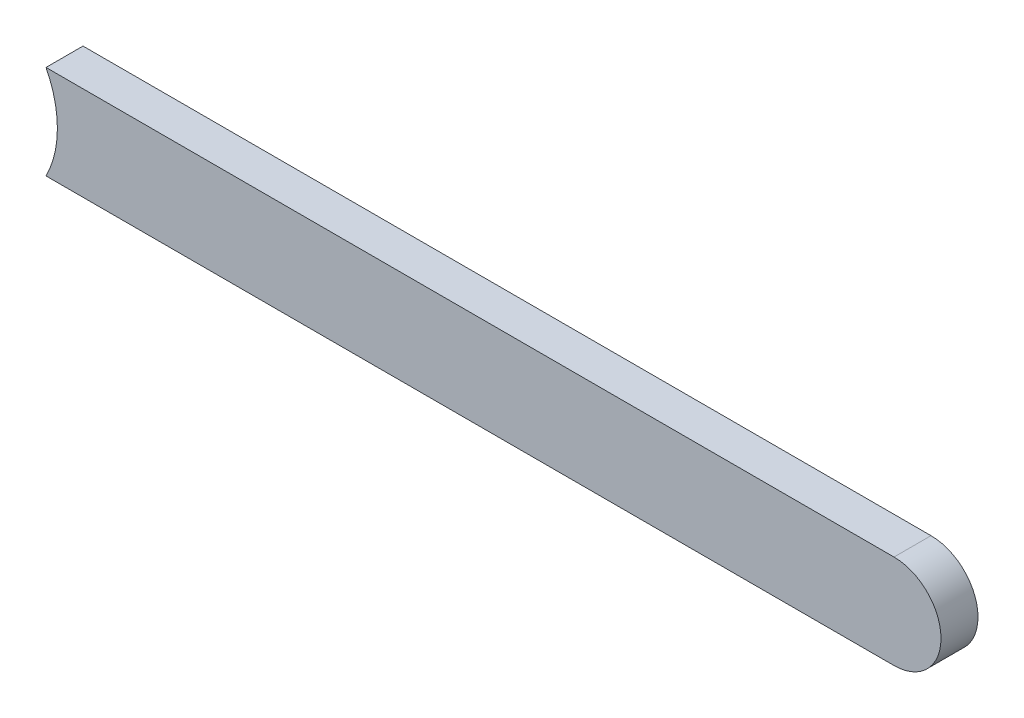
ISO-10303-21;
HEADER;
FILE_DESCRIPTION(('STEP AP214'),'2;1');
FILE_NAME('part.step','',(''),(''),'','','');
FILE_SCHEMA(('AUTOMOTIVE_DESIGN { 1 0 10303 214 1 1 1 1 }'));
ENDSEC;
DATA;
#1=APPLICATION_CONTEXT('core data for automotive mechanical design processes');
#2=APPLICATION_PROTOCOL_DEFINITION('international standard','automotive_design',2000,#1);
#3=PRODUCT_CONTEXT('',#1,'mechanical');
#4=PRODUCT('Part','Part','',(#3));
#5=PRODUCT_RELATED_PRODUCT_CATEGORY('part','',(#4));
#6=PRODUCT_DEFINITION_FORMATION('','',#4);
#7=PRODUCT_DEFINITION_CONTEXT('part definition',#1,'design');
#8=PRODUCT_DEFINITION('design','',#6,#7);
#9=PRODUCT_DEFINITION_SHAPE('','',#8);
#10=(LENGTH_UNIT() NAMED_UNIT(*) SI_UNIT(.MILLI.,.METRE.));
#11=(NAMED_UNIT(*) PLANE_ANGLE_UNIT() SI_UNIT($,.RADIAN.));
#12=(NAMED_UNIT(*) SI_UNIT($,.STERADIAN.) SOLID_ANGLE_UNIT());
#13=UNCERTAINTY_MEASURE_WITH_UNIT(LENGTH_MEASURE(1.E-05),#10,'distance_accuracy_value','');
#14=(GEOMETRIC_REPRESENTATION_CONTEXT(3) GLOBAL_UNCERTAINTY_ASSIGNED_CONTEXT((#13)) GLOBAL_UNIT_ASSIGNED_CONTEXT((#10,
#11,#12)) REPRESENTATION_CONTEXT('',''));
#15=CARTESIAN_POINT('',(0.,0.,0.));
#16=DIRECTION('',(0.,0.,1.));
#17=DIRECTION('',(1.,0.,0.));
#18=AXIS2_PLACEMENT_3D('',#15,#16,#17);
#19=CARTESIAN_POINT('',(134.224466490858,88.1350028,0.));
#20=DIRECTION('',(0.,1.,0.));
#21=DIRECTION('',(1.,0.,0.));
#22=AXIS2_PLACEMENT_3D('',#19,#20,#21);
#23=PLANE('',#22);
#24=DIRECTION('',(1.,0.,0.));
#25=VECTOR('',#24,1.);
#26=CARTESIAN_POINT('',(133.731,88.1350028,0.1999996));
#27=LINE('',#26,#25);
#28=CARTESIAN_POINT('',(134.224466490858,88.1350028,0.1999996));
#29=VERTEX_POINT('',#28);
#30=CARTESIAN_POINT('',(138.8080028,88.1350028,0.1999996));
#31=VERTEX_POINT('',#30);
#32=EDGE_CURVE('E11',#29,#31,#27,.T.);
#33=ORIENTED_EDGE('',*,*,#32,.F.);
#34=DIRECTION('',(0.,0.,1.));
#35=VECTOR('',#34,1.);
#36=CARTESIAN_POINT('',(134.224466490858,88.1350028,0.));
#37=LINE('',#36,#35);
#38=CARTESIAN_POINT('',(134.224466490858,88.1350028,0.));
#39=VERTEX_POINT('',#38);
#40=EDGE_CURVE('E24',#39,#29,#37,.T.);
#41=ORIENTED_EDGE('',*,*,#40,.F.);
#42=DIRECTION('',(1.,0.,0.));
#43=VECTOR('',#42,1.);
#44=CARTESIAN_POINT('',(133.731,88.1350028,0.));
#45=LINE('',#44,#43);
#46=CARTESIAN_POINT('',(138.8080028,88.1350028,0.));
#47=VERTEX_POINT('',#46);
#48=EDGE_CURVE('E82',#39,#47,#45,.T.);
#49=ORIENTED_EDGE('',*,*,#48,.T.);
#50=DIRECTION('',(0.,0.,1.));
#51=VECTOR('',#50,1.);
#52=CARTESIAN_POINT('',(138.8080028,88.1350028,0.));
#53=LINE('',#52,#51);
#54=EDGE_CURVE('E37',#47,#31,#53,.T.);
#55=ORIENTED_EDGE('',*,*,#54,.T.);
#56=EDGE_LOOP('',(#33,#41,#49,#55));
#57=FACE_BOUND('',#56,.T.);
#58=ADVANCED_FACE('F17',(#57),#23,.F.);
#59=CARTESIAN_POINT('',(138.8080028,88.3890028,0.));
#60=DIRECTION('',(0.,0.,-1.));
#61=DIRECTION('',(0.,-1.,0.));
#62=AXIS2_PLACEMENT_3D('',#59,#60,#61);
#63=CYLINDRICAL_SURFACE('',#62,0.253999999999995);
#64=CARTESIAN_POINT('',(138.8080028,88.3890028,0.1999996));
#65=DIRECTION('',(0.,0.,1.));
#66=DIRECTION('',(0.,-1.,0.));
#67=AXIS2_PLACEMENT_3D('',#64,#65,#66);
#68=CIRCLE('',#67,0.253999999999995);
#69=CARTESIAN_POINT('',(138.8080028,88.6430028,0.1999996));
#70=VERTEX_POINT('',#69);
#71=EDGE_CURVE('E97',#31,#70,#68,.T.);
#72=ORIENTED_EDGE('',*,*,#71,.F.);
#73=ORIENTED_EDGE('',*,*,#54,.F.);
#74=CARTESIAN_POINT('',(138.8080028,88.3890028,0.));
#75=DIRECTION('',(0.,0.,1.));
#76=DIRECTION('',(0.,-1.,0.));
#77=AXIS2_PLACEMENT_3D('',#74,#75,#76);
#78=CIRCLE('',#77,0.253999999999995);
#79=CARTESIAN_POINT('',(138.8080028,88.6430028,0.));
#80=VERTEX_POINT('',#79);
#81=EDGE_CURVE('E94',#47,#80,#78,.T.);
#82=ORIENTED_EDGE('',*,*,#81,.T.);
#83=DIRECTION('',(0.,0.,1.));
#84=VECTOR('',#83,1.);
#85=CARTESIAN_POINT('',(138.8080028,88.6430028,0.));
#86=LINE('',#85,#84);
#87=EDGE_CURVE('E92',#80,#70,#86,.T.);
#88=ORIENTED_EDGE('',*,*,#87,.T.);
#89=EDGE_LOOP('',(#72,#73,#82,#88));
#90=FACE_BOUND('',#89,.T.);
#91=ADVANCED_FACE('F103',(#90),#63,.T.);
#92=CARTESIAN_POINT('',(138.8080028,88.6430028,0.));
#93=DIRECTION('',(0.,-1.,0.));
#94=DIRECTION('',(-1.,0.,0.));
#95=AXIS2_PLACEMENT_3D('',#92,#93,#94);
#96=PLANE('',#95);
#97=DIRECTION('',(-1.,0.,0.));
#98=VECTOR('',#97,1.);
#99=CARTESIAN_POINT('',(138.8080028,88.6430028,0.1999996));
#100=LINE('',#99,#98);
#101=CARTESIAN_POINT('',(134.224466490858,88.6430028,0.1999996));
#102=VERTEX_POINT('',#101);
#103=EDGE_CURVE('E89',#70,#102,#100,.T.);
#104=ORIENTED_EDGE('',*,*,#103,.F.);
#105=ORIENTED_EDGE('',*,*,#87,.F.);
#106=DIRECTION('',(-1.,0.,0.));
#107=VECTOR('',#106,1.);
#108=CARTESIAN_POINT('',(138.8080028,88.6430028,0.));
#109=LINE('',#108,#107);
#110=CARTESIAN_POINT('',(134.224466490858,88.6430028,0.));
#111=VERTEX_POINT('',#110);
#112=EDGE_CURVE('E87',#80,#111,#109,.T.);
#113=ORIENTED_EDGE('',*,*,#112,.T.);
#114=DIRECTION('',(0.,0.,1.));
#115=VECTOR('',#114,1.);
#116=CARTESIAN_POINT('',(134.224466490858,88.6430028,0.));
#117=LINE('',#116,#115);
#118=EDGE_CURVE('E69',#111,#102,#117,.T.);
#119=ORIENTED_EDGE('',*,*,#118,.T.);
#120=EDGE_LOOP('',(#104,#105,#113,#119));
#121=FACE_BOUND('',#120,.T.);
#122=ADVANCED_FACE('F108',(#121),#96,.F.);
#123=CARTESIAN_POINT('',(133.731,88.3890028,0.));
#124=DIRECTION('',(0.,0.,-1.));
#125=DIRECTION('',(1.,0.,0.));
#126=AXIS2_PLACEMENT_3D('',#123,#124,#125);
#127=CYLINDRICAL_SURFACE('',#126,0.55500016);
#128=DIRECTION('',(0.,0.,1.));
#129=VECTOR('',#128,1.);
#130=CARTESIAN_POINT('',(134.28600016,88.3890028,0.));
#131=LINE('',#130,#129);
#132=CARTESIAN_POINT('',(134.28600016,88.3890028,0.));
#133=VERTEX_POINT('',#132);
#134=CARTESIAN_POINT('',(134.28600016,88.3890028,0.1999996));
#135=VERTEX_POINT('',#134);
#136=EDGE_CURVE('E59',#133,#135,#131,.T.);
#137=ORIENTED_EDGE('',*,*,#136,.T.);
#138=CARTESIAN_POINT('',(133.731,88.3890028,0.1999996));
#139=DIRECTION('',(0.,0.,1.));
#140=DIRECTION('',(1.,0.,0.));
#141=AXIS2_PLACEMENT_3D('',#138,#139,#140);
#142=CIRCLE('',#141,0.55500016);
#143=EDGE_CURVE('E70',#135,#102,#142,.T.);
#144=ORIENTED_EDGE('',*,*,#143,.T.);
#145=ORIENTED_EDGE('',*,*,#118,.F.);
#146=CARTESIAN_POINT('',(133.731,88.3890028,0.));
#147=DIRECTION('',(0.,0.,1.));
#148=DIRECTION('',(1.,0.,0.));
#149=AXIS2_PLACEMENT_3D('',#146,#147,#148);
#150=CIRCLE('',#149,0.55500016);
#151=EDGE_CURVE('E73',#133,#111,#150,.T.);
#152=ORIENTED_EDGE('',*,*,#151,.F.);
#153=EDGE_LOOP('',(#137,#144,#145,#152));
#154=FACE_BOUND('',#153,.T.);
#155=ADVANCED_FACE('F74',(#154),#127,.F.);
#156=CARTESIAN_POINT('',(133.731,88.3890028,0.));
#157=DIRECTION('',(0.,0.,-1.));
#158=DIRECTION('',(1.,0.,0.));
#159=AXIS2_PLACEMENT_3D('',#156,#157,#158);
#160=CYLINDRICAL_SURFACE('',#159,0.55500016);
#161=ORIENTED_EDGE('',*,*,#40,.T.);
#162=CARTESIAN_POINT('',(133.731,88.3890028,0.1999996));
#163=DIRECTION('',(0.,0.,1.));
#164=DIRECTION('',(1.,0.,0.));
#165=AXIS2_PLACEMENT_3D('',#162,#163,#164);
#166=CIRCLE('',#165,0.55500016);
#167=EDGE_CURVE('E65',#29,#135,#166,.T.);
#168=ORIENTED_EDGE('',*,*,#167,.T.);
#169=ORIENTED_EDGE('',*,*,#136,.F.);
#170=EDGE_CURVE('E63',#39,#133,#150,.T.);
#171=ORIENTED_EDGE('',*,*,#170,.F.);
#172=EDGE_LOOP('',(#161,#168,#169,#171));
#173=FACE_BOUND('',#172,.T.);
#174=ADVANCED_FACE('F61',(#173),#160,.F.);
#175=CARTESIAN_POINT('',(133.731,88.1350028,0.));
#176=DIRECTION('',(0.,0.,-1.));
#177=DIRECTION('',(-1.,0.,0.));
#178=AXIS2_PLACEMENT_3D('',#175,#176,#177);
#179=PLANE('',#178);
#180=ORIENTED_EDGE('',*,*,#48,.F.);
#181=ORIENTED_EDGE('',*,*,#170,.T.);
#182=ORIENTED_EDGE('',*,*,#151,.T.);
#183=ORIENTED_EDGE('',*,*,#112,.F.);
#184=ORIENTED_EDGE('',*,*,#81,.F.);
#185=EDGE_LOOP('',(#180,#181,#182,#183,#184));
#186=FACE_BOUND('',#185,.T.);
#187=ADVANCED_FACE('F80',(#186),#179,.T.);
#188=CARTESIAN_POINT('',(133.731,88.1350028,0.1999996));
#189=DIRECTION('',(0.,0.,-1.));
#190=DIRECTION('',(-1.,0.,0.));
#191=AXIS2_PLACEMENT_3D('',#188,#189,#190);
#192=PLANE('',#191);
#193=ORIENTED_EDGE('',*,*,#167,.F.);
#194=ORIENTED_EDGE('',*,*,#32,.T.);
#195=ORIENTED_EDGE('',*,*,#71,.T.);
#196=ORIENTED_EDGE('',*,*,#103,.T.);
#197=ORIENTED_EDGE('',*,*,#143,.F.);
#198=EDGE_LOOP('',(#193,#194,#195,#196,#197));
#199=FACE_BOUND('',#198,.T.);
#200=ADVANCED_FACE('F106',(#199),#192,.F.);
#201=CLOSED_SHELL('',(#58,#91,#122,#155,#174,#187,#200));
#202=MANIFOLD_SOLID_BREP('B1',#201);
#203=ADVANCED_BREP_SHAPE_REPRESENTATION('',(#18,#202),#14);
#204=SHAPE_DEFINITION_REPRESENTATION(#9,#203);
ENDSEC;
END-ISO-10303-21;
